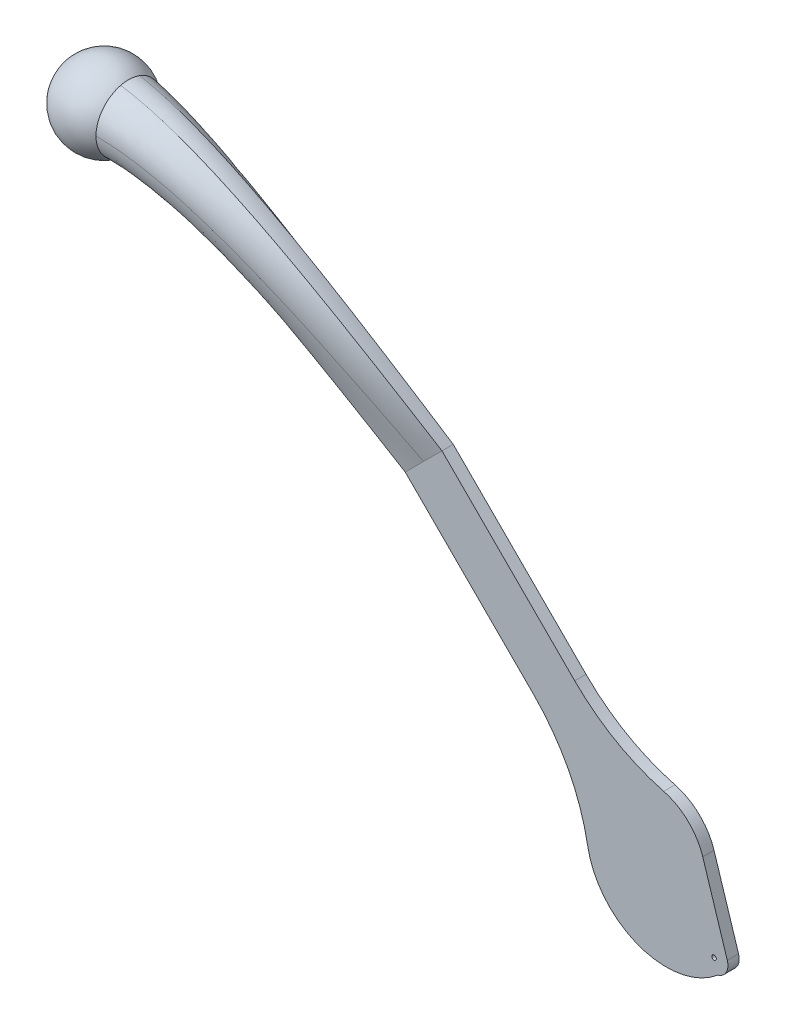
ISO-10303-21;
HEADER;
FILE_DESCRIPTION(('STEP AP214'),'2;1');
FILE_NAME('part.step','',(''),(''),'','','');
FILE_SCHEMA(('AUTOMOTIVE_DESIGN { 1 0 10303 214 1 1 1 1 }'));
ENDSEC;
DATA;
#1=APPLICATION_CONTEXT('core data for automotive mechanical design processes');
#2=APPLICATION_PROTOCOL_DEFINITION('international standard','automotive_design',2000,#1);
#3=PRODUCT_CONTEXT('',#1,'mechanical');
#4=PRODUCT('Part','Part','',(#3));
#5=PRODUCT_RELATED_PRODUCT_CATEGORY('part','',(#4));
#6=PRODUCT_DEFINITION_FORMATION('','',#4);
#7=PRODUCT_DEFINITION_CONTEXT('part definition',#1,'design');
#8=PRODUCT_DEFINITION('design','',#6,#7);
#9=PRODUCT_DEFINITION_SHAPE('','',#8);
#10=(LENGTH_UNIT() NAMED_UNIT(*) SI_UNIT(.MILLI.,.METRE.));
#11=(NAMED_UNIT(*) PLANE_ANGLE_UNIT() SI_UNIT($,.RADIAN.));
#12=(NAMED_UNIT(*) SI_UNIT($,.STERADIAN.) SOLID_ANGLE_UNIT());
#13=UNCERTAINTY_MEASURE_WITH_UNIT(LENGTH_MEASURE(1.E-05),#10,'distance_accuracy_value','');
#14=(GEOMETRIC_REPRESENTATION_CONTEXT(3) GLOBAL_UNCERTAINTY_ASSIGNED_CONTEXT((#13)) GLOBAL_UNIT_ASSIGNED_CONTEXT((#10,
#11,#12)) REPRESENTATION_CONTEXT('',''));
#15=CARTESIAN_POINT('',(0.,0.,0.));
#16=DIRECTION('',(0.,0.,1.));
#17=DIRECTION('',(1.,0.,0.));
#18=AXIS2_PLACEMENT_3D('',#15,#16,#17);
#19=CARTESIAN_POINT('',(-107.150199067263,-107.150199067263,186.923253530233));
#20=DIRECTION('',(-0.707106781186547,-0.707106781186548,0.));
#21=DIRECTION('',(0.707106781186548,-0.707106781186547,0.));
#22=AXIS2_PLACEMENT_3D('',#19,#20,#21);
#23=PLANE('',#22);
#24=DIRECTION('',(0.,0.,1.));
#25=VECTOR('',#24,1.);
#26=CARTESIAN_POINT('',(-67.8559594323085,-146.444438702217,186.923253530233));
#27=LINE('',#26,#25);
#28=CARTESIAN_POINT('',(-67.8559594323085,-146.444438702217,186.923253530233));
#29=VERTEX_POINT('',#28);
#30=CARTESIAN_POINT('',(-67.8559594323085,-146.444438702217,192.003253530233));
#31=VERTEX_POINT('',#30);
#32=EDGE_CURVE('E366',#29,#31,#27,.T.);
#33=ORIENTED_EDGE('',*,*,#32,.T.);
#34=DIRECTION('',(0.707106781186548,-0.707106781186547,0.));
#35=VECTOR('',#34,1.);
#36=CARTESIAN_POINT('',(-107.150199067263,-107.150199067263,192.003253530233));
#37=LINE('',#36,#35);
#38=CARTESIAN_POINT('',(-125.355351673041,-88.945046461485,192.003253530233));
#39=VERTEX_POINT('',#38);
#40=EDGE_CURVE('E319',#39,#31,#37,.T.);
#41=ORIENTED_EDGE('',*,*,#40,.F.);
#42=DIRECTION('',(0.,0.,1.));
#43=VECTOR('',#42,1.);
#44=CARTESIAN_POINT('',(-125.355351673041,-88.945046461485,186.923253530233));
#45=LINE('',#44,#43);
#46=CARTESIAN_POINT('',(-125.355351673041,-88.945046461485,186.923253530233));
#47=VERTEX_POINT('',#46);
#48=EDGE_CURVE('E49',#47,#39,#45,.T.);
#49=ORIENTED_EDGE('',*,*,#48,.F.);
#50=DIRECTION('',(0.707106781186548,-0.707106781186547,0.));
#51=VECTOR('',#50,1.);
#52=CARTESIAN_POINT('',(-107.150199067263,-107.150199067263,186.923253530233));
#53=LINE('',#52,#51);
#54=EDGE_CURVE('E339',#47,#29,#53,.T.);
#55=ORIENTED_EDGE('',*,*,#54,.T.);
#56=EDGE_LOOP('',(#33,#41,#49,#55));
#57=FACE_BOUND('',#56,.T.);
#58=ADVANCED_FACE('F45',(#57),#23,.T.);
#59=CARTESIAN_POINT('',(-90.6102871193429,-90.6102871193429,186.923253530233));
#60=DIRECTION('',(0.707106781186547,0.707106781186548,0.));
#61=DIRECTION('',(-0.707106781186548,0.707106781186547,0.));
#62=AXIS2_PLACEMENT_3D('',#59,#60,#61);
#63=PLANE('',#62);
#64=DIRECTION('',(0.,0.,1.));
#65=VECTOR('',#64,1.);
#66=CARTESIAN_POINT('',(-108.815439725121,-72.405134513565,186.923253530233));
#67=LINE('',#66,#65);
#68=CARTESIAN_POINT('',(-108.815439725121,-72.405134513565,186.923253530233));
#69=VERTEX_POINT('',#68);
#70=CARTESIAN_POINT('',(-108.815439725121,-72.405134513565,192.003253530233));
#71=VERTEX_POINT('',#70);
#72=EDGE_CURVE('E298',#69,#71,#67,.T.);
#73=ORIENTED_EDGE('',*,*,#72,.T.);
#74=DIRECTION('',(-0.707106781186548,0.707106781186547,0.));
#75=VECTOR('',#74,1.);
#76=CARTESIAN_POINT('',(-90.6102871193429,-90.6102871193429,192.003253530233));
#77=LINE('',#76,#75);
#78=CARTESIAN_POINT('',(-49.0428683704548,-132.177705868231,192.003253530233));
#79=VERTEX_POINT('',#78);
#80=EDGE_CURVE('E287',#79,#71,#77,.T.);
#81=ORIENTED_EDGE('',*,*,#80,.F.);
#82=DIRECTION('',(0.,0.,1.));
#83=VECTOR('',#82,1.);
#84=CARTESIAN_POINT('',(-49.0428683704548,-132.177705868231,186.923253530233));
#85=LINE('',#84,#83);
#86=CARTESIAN_POINT('',(-49.0428683704548,-132.177705868231,186.923253530233));
#87=VERTEX_POINT('',#86);
#88=EDGE_CURVE('E11',#87,#79,#85,.T.);
#89=ORIENTED_EDGE('',*,*,#88,.F.);
#90=DIRECTION('',(-0.707106781186548,0.707106781186547,0.));
#91=VECTOR('',#90,1.);
#92=CARTESIAN_POINT('',(-90.6102871193429,-90.6102871193429,186.923253530233));
#93=LINE('',#92,#91);
#94=EDGE_CURVE('E72',#87,#69,#93,.T.);
#95=ORIENTED_EDGE('',*,*,#94,.T.);
#96=EDGE_LOOP('',(#73,#81,#89,#95));
#97=FACE_BOUND('',#96,.T.);
#98=ADVANCED_FACE('F250',(#97),#63,.T.);
#99=CARTESIAN_POINT('',(13.8189244770289,-69.3159130207465,186.923253530233));
#100=DIRECTION('',(0.,0.,1.));
#101=DIRECTION('',(1.,0.,0.));
#102=AXIS2_PLACEMENT_3D('',#99,#100,#101);
#103=CYLINDRICAL_SURFACE('',#102,88.9);
#104=ORIENTED_EDGE('',*,*,#88,.T.);
#105=CARTESIAN_POINT('',(13.8189244770289,-69.3159130207465,192.003253530233));
#106=DIRECTION('',(0.,0.,1.));
#107=DIRECTION('',(1.,0.,0.));
#108=AXIS2_PLACEMENT_3D('',#105,#106,#107);
#109=CIRCLE('',#108,88.9);
#110=CARTESIAN_POINT('',(-8.96826600026344,-155.245849306954,192.003253530233));
#111=VERTEX_POINT('',#110);
#112=EDGE_CURVE('E295',#79,#111,#109,.T.);
#113=ORIENTED_EDGE('',*,*,#112,.T.);
#114=DIRECTION('',(0.,0.,1.));
#115=VECTOR('',#114,1.);
#116=CARTESIAN_POINT('',(-8.96826600026344,-155.245849306954,186.923253530233));
#117=LINE('',#116,#115);
#118=CARTESIAN_POINT('',(-8.96826600026344,-155.245849306954,186.923253530233));
#119=VERTEX_POINT('',#118);
#120=EDGE_CURVE('E55',#119,#111,#117,.T.);
#121=ORIENTED_EDGE('',*,*,#120,.F.);
#122=CARTESIAN_POINT('',(13.8189244770289,-69.3159130207465,186.923253530233));
#123=DIRECTION('',(0.,0.,1.));
#124=DIRECTION('',(1.,0.,0.));
#125=AXIS2_PLACEMENT_3D('',#122,#123,#124);
#126=CIRCLE('',#125,88.9);
#127=EDGE_CURVE('E355',#87,#119,#126,.T.);
#128=ORIENTED_EDGE('',*,*,#127,.F.);
#129=EDGE_LOOP('',(#104,#113,#121,#128));
#130=FACE_BOUND('',#129,.T.);
#131=ADVANCED_FACE('F271',(#130),#103,.F.);
#132=CARTESIAN_POINT('',(-15.42794024578,-179.605122421383,186.923253530233));
#133=DIRECTION('',(0.,0.,1.));
#134=DIRECTION('',(1.,0.,0.));
#135=AXIS2_PLACEMENT_3D('',#132,#133,#134);
#136=CYLINDRICAL_SURFACE('',#135,25.2012217565252);
#137=ORIENTED_EDGE('',*,*,#120,.T.);
#138=CARTESIAN_POINT('',(-15.42794024578,-179.605122421383,192.003253530233));
#139=DIRECTION('',(0.,0.,1.));
#140=DIRECTION('',(1.,0.,0.));
#141=AXIS2_PLACEMENT_3D('',#138,#139,#140);
#142=CIRCLE('',#141,25.2012217565252);
#143=CARTESIAN_POINT('',(8.59356538739768,-171.984830751324,192.003253530233));
#144=VERTEX_POINT('',#143);
#145=EDGE_CURVE('E332',#144,#111,#142,.T.);
#146=ORIENTED_EDGE('',*,*,#145,.F.);
#147=DIRECTION('',(0.,0.,1.));
#148=VECTOR('',#147,1.);
#149=CARTESIAN_POINT('',(8.59356538739768,-171.984830751324,186.923253530233));
#150=LINE('',#149,#148);
#151=CARTESIAN_POINT('',(8.59356538739768,-171.984830751324,186.923253530233));
#152=VERTEX_POINT('',#151);
#153=EDGE_CURVE('E358',#152,#144,#150,.T.);
#154=ORIENTED_EDGE('',*,*,#153,.F.);
#155=CARTESIAN_POINT('',(-15.42794024578,-179.605122421383,186.923253530233));
#156=DIRECTION('',(0.,0.,1.));
#157=DIRECTION('',(1.,0.,0.));
#158=AXIS2_PLACEMENT_3D('',#155,#156,#157);
#159=CIRCLE('',#158,25.2012217565252);
#160=EDGE_CURVE('E352',#152,#119,#159,.T.);
#161=ORIENTED_EDGE('',*,*,#160,.T.);
#162=EDGE_LOOP('',(#137,#146,#154,#161));
#163=FACE_BOUND('',#162,.T.);
#164=ADVANCED_FACE('F267',(#163),#136,.T.);
#165=CARTESIAN_POINT('',(-41.7621478024849,-13.2481182438251,186.923253530233));
#166=DIRECTION('',(0.953188137672649,0.302377866584422,0.));
#167=DIRECTION('',(-0.302377866584422,0.95318813767265,0.));
#168=AXIS2_PLACEMENT_3D('',#165,#166,#167);
#169=PLANE('',#168);
#170=ORIENTED_EDGE('',*,*,#153,.T.);
#171=DIRECTION('',(-0.302377866584422,0.953188137672649,0.));
#172=VECTOR('',#171,1.);
#173=CARTESIAN_POINT('',(-41.7621478024849,-13.2481182438251,192.003253530233));
#174=LINE('',#173,#172);
#175=CARTESIAN_POINT('',(19.6489298910755,-206.834743615601,192.003253530233));
#176=VERTEX_POINT('',#175);
#177=EDGE_CURVE('E329',#176,#144,#174,.T.);
#178=ORIENTED_EDGE('',*,*,#177,.F.);
#179=DIRECTION('',(0.,0.,1.));
#180=VECTOR('',#179,1.);
#181=CARTESIAN_POINT('',(19.6489298910755,-206.834743615601,186.923253530233));
#182=LINE('',#181,#180);
#183=CARTESIAN_POINT('',(19.6489298910755,-206.834743615601,186.923253530233));
#184=VERTEX_POINT('',#183);
#185=EDGE_CURVE('E360',#184,#176,#182,.T.);
#186=ORIENTED_EDGE('',*,*,#185,.F.);
#187=DIRECTION('',(-0.302377866584422,0.953188137672649,0.));
#188=VECTOR('',#187,1.);
#189=CARTESIAN_POINT('',(-41.7621478024849,-13.2481182438251,186.923253530233));
#190=LINE('',#189,#188);
#191=EDGE_CURVE('E349',#184,#152,#190,.T.);
#192=ORIENTED_EDGE('',*,*,#191,.T.);
#193=EDGE_LOOP('',(#170,#178,#186,#192));
#194=FACE_BOUND('',#193,.T.);
#195=ADVANCED_FACE('F263',(#194),#169,.T.);
#196=CARTESIAN_POINT('',(13.6915333224159,-208.724595989579,186.923253530233));
#197=DIRECTION('',(0.,0.,1.));
#198=DIRECTION('',(1.,0.,0.));
#199=AXIS2_PLACEMENT_3D('',#196,#197,#198);
#200=CYLINDRICAL_SURFACE('',#199,6.24996926966111);
#201=ORIENTED_EDGE('',*,*,#185,.T.);
#202=CARTESIAN_POINT('',(13.6915333224159,-208.724595989579,192.003253530233));
#203=DIRECTION('',(0.,0.,1.));
#204=DIRECTION('',(1.,0.,0.));
#205=AXIS2_PLACEMENT_3D('',#202,#203,#204);
#206=CIRCLE('',#205,6.24996926966111);
#207=CARTESIAN_POINT('',(15.364323678405,-214.746546528783,192.003253530233));
#208=VERTEX_POINT('',#207);
#209=EDGE_CURVE('E326',#208,#176,#206,.T.);
#210=ORIENTED_EDGE('',*,*,#209,.F.);
#211=DIRECTION('',(0.,0.,1.));
#212=VECTOR('',#211,1.);
#213=CARTESIAN_POINT('',(15.364323678405,-214.746546528783,186.923253530233));
#214=LINE('',#213,#212);
#215=CARTESIAN_POINT('',(15.364323678405,-214.746546528783,186.923253530233));
#216=VERTEX_POINT('',#215);
#217=EDGE_CURVE('E362',#216,#208,#214,.T.);
#218=ORIENTED_EDGE('',*,*,#217,.F.);
#219=CARTESIAN_POINT('',(13.6915333224159,-208.724595989579,186.923253530233));
#220=DIRECTION('',(0.,0.,1.));
#221=DIRECTION('',(1.,0.,0.));
#222=AXIS2_PLACEMENT_3D('',#219,#220,#221);
#223=CIRCLE('',#222,6.24996926966111);
#224=EDGE_CURVE('E346',#216,#184,#223,.T.);
#225=ORIENTED_EDGE('',*,*,#224,.T.);
#226=EDGE_LOOP('',(#201,#210,#218,#225));
#227=FACE_BOUND('',#226,.T.);
#228=ADVANCED_FACE('F259',(#227),#200,.T.);
#229=CARTESIAN_POINT('',(-7.80794024578001,-187.225122421383,186.923253530233));
#230=DIRECTION('',(0.,0.,1.));
#231=DIRECTION('',(1.,0.,0.));
#232=AXIS2_PLACEMENT_3D('',#229,#230,#231);
#233=CYLINDRICAL_SURFACE('',#232,35.9775291018081);
#234=ORIENTED_EDGE('',*,*,#217,.T.);
#235=CARTESIAN_POINT('',(-7.80794024578001,-187.225122421383,192.003253530233));
#236=DIRECTION('',(0.,0.,1.));
#237=DIRECTION('',(1.,0.,0.));
#238=AXIS2_PLACEMENT_3D('',#235,#236,#237);
#239=CIRCLE('',#238,35.9775291018081);
#240=CARTESIAN_POINT('',(-43.2185651288713,-193.586745300841,192.003253530233));
#241=VERTEX_POINT('',#240);
#242=EDGE_CURVE('E323',#241,#208,#239,.T.);
#243=ORIENTED_EDGE('',*,*,#242,.F.);
#244=DIRECTION('',(0.,0.,1.));
#245=VECTOR('',#244,1.);
#246=CARTESIAN_POINT('',(-43.2185651288713,-193.586745300841,186.923253530233));
#247=LINE('',#246,#245);
#248=CARTESIAN_POINT('',(-43.2185651288713,-193.586745300841,186.923253530233));
#249=VERTEX_POINT('',#248);
#250=EDGE_CURVE('E364',#249,#241,#247,.T.);
#251=ORIENTED_EDGE('',*,*,#250,.F.);
#252=CARTESIAN_POINT('',(-7.80794024578001,-187.225122421383,186.923253530233));
#253=DIRECTION('',(0.,0.,1.));
#254=DIRECTION('',(1.,0.,0.));
#255=AXIS2_PLACEMENT_3D('',#252,#253,#254);
#256=CIRCLE('',#255,35.9775291018081);
#257=EDGE_CURVE('E343',#249,#216,#256,.T.);
#258=ORIENTED_EDGE('',*,*,#257,.T.);
#259=EDGE_LOOP('',(#234,#243,#251,#258));
#260=FACE_BOUND('',#259,.T.);
#261=ADVANCED_FACE('F256',(#260),#233,.T.);
#262=CARTESIAN_POINT('',(13.6915333224159,-208.724595989579,186.923253530233));
#263=DIRECTION('',(0.,0.,1.));
#264=DIRECTION('',(1.,0.,0.));
#265=AXIS2_PLACEMENT_3D('',#262,#263,#264);
#266=CYLINDRICAL_SURFACE('',#265,1.01600000000001);
#267=CARTESIAN_POINT('',(13.6915333224159,-208.724595989579,186.923253530233));
#268=DIRECTION('',(0.,0.,1.));
#269=DIRECTION('',(1.,0.,0.));
#270=AXIS2_PLACEMENT_3D('',#267,#268,#269);
#271=CIRCLE('',#270,1.01600000000001);
#272=CARTESIAN_POINT('',(14.7075333224159,-208.724595989579,186.923253530233));
#273=VERTEX_POINT('',#272);
#274=EDGE_CURVE('E294',#273,#273,#271,.T.);
#275=ORIENTED_EDGE('',*,*,#274,.F.);
#276=EDGE_LOOP('',(#275));
#277=FACE_BOUND('',#276,.T.);
#278=CARTESIAN_POINT('',(13.6915333224159,-208.724595989579,192.003253530233));
#279=DIRECTION('',(0.,0.,1.));
#280=DIRECTION('',(1.,0.,0.));
#281=AXIS2_PLACEMENT_3D('',#278,#279,#280);
#282=CIRCLE('',#281,1.01600000000001);
#283=CARTESIAN_POINT('',(14.7075333224159,-208.724595989579,192.003253530233));
#284=VERTEX_POINT('',#283);
#285=EDGE_CURVE('E316',#284,#284,#282,.T.);
#286=ORIENTED_EDGE('',*,*,#285,.T.);
#287=EDGE_LOOP('',(#286));
#288=FACE_BOUND('',#287,.T.);
#289=ADVANCED_FACE('F47',(#277,#288),#266,.F.);
#290=CARTESIAN_POINT('',(-130.717752279792,-209.306231549702,186.923253530233));
#291=DIRECTION('',(0.,0.,1.));
#292=DIRECTION('',(1.,0.,0.));
#293=AXIS2_PLACEMENT_3D('',#290,#291,#292);
#294=CYLINDRICAL_SURFACE('',#293,88.9);
#295=ORIENTED_EDGE('',*,*,#250,.T.);
#296=CARTESIAN_POINT('',(-130.717752279792,-209.306231549702,192.003253530233));
#297=DIRECTION('',(0.,0.,1.));
#298=DIRECTION('',(1.,0.,0.));
#299=AXIS2_PLACEMENT_3D('',#296,#297,#298);
#300=CIRCLE('',#299,88.9);
#301=EDGE_CURVE('E320',#31,#241,#300,.F.);
#302=ORIENTED_EDGE('',*,*,#301,.F.);
#303=ORIENTED_EDGE('',*,*,#32,.F.);
#304=CARTESIAN_POINT('',(-130.717752279792,-209.306231549702,186.923253530233));
#305=DIRECTION('',(0.,0.,1.));
#306=DIRECTION('',(1.,0.,0.));
#307=AXIS2_PLACEMENT_3D('',#304,#305,#306);
#308=CIRCLE('',#307,88.9);
#309=EDGE_CURVE('E340',#29,#249,#308,.F.);
#310=ORIENTED_EDGE('',*,*,#309,.T.);
#311=EDGE_LOOP('',(#295,#302,#303,#310));
#312=FACE_BOUND('',#311,.T.);
#313=ADVANCED_FACE('F251',(#312),#294,.F.);
#314=CARTESIAN_POINT('',(0.,0.,186.923253530233));
#315=DIRECTION('',(0.,0.,1.));
#316=DIRECTION('',(1.,0.,0.));
#317=AXIS2_PLACEMENT_3D('',#314,#315,#316);
#318=PLANE('',#317);
#319=ORIENTED_EDGE('',*,*,#274,.T.);
#320=EDGE_LOOP('',(#319));
#321=FACE_BOUND('',#320,.T.);
#322=ORIENTED_EDGE('',*,*,#54,.F.);
#323=DIRECTION('',(-0.707106781186548,-0.707106781186547,0.));
#324=VECTOR('',#323,1.);
#325=CARTESIAN_POINT('',(-18.2051526057778,18.2051526057778,186.923253530233));
#326=LINE('',#325,#324);
#327=EDGE_CURVE('E300',#69,#47,#326,.T.);
#328=ORIENTED_EDGE('',*,*,#327,.F.);
#329=ORIENTED_EDGE('',*,*,#94,.F.);
#330=ORIENTED_EDGE('',*,*,#127,.T.);
#331=ORIENTED_EDGE('',*,*,#160,.F.);
#332=ORIENTED_EDGE('',*,*,#191,.F.);
#333=ORIENTED_EDGE('',*,*,#224,.F.);
#334=ORIENTED_EDGE('',*,*,#257,.F.);
#335=ORIENTED_EDGE('',*,*,#309,.F.);
#336=EDGE_LOOP('',(#322,#328,#329,#330,#331,#332,#333,#334,#335));
#337=FACE_BOUND('',#336,.T.);
#338=ADVANCED_FACE('F254',(#321,#337),#318,.F.);
#339=CARTESIAN_POINT('',(0.,0.,192.003253530233));
#340=DIRECTION('',(0.,0.,1.));
#341=DIRECTION('',(1.,0.,0.));
#342=AXIS2_PLACEMENT_3D('',#339,#340,#341);
#343=PLANE('',#342);
#344=ORIENTED_EDGE('',*,*,#285,.F.);
#345=EDGE_LOOP('',(#344));
#346=FACE_BOUND('',#345,.T.);
#347=ORIENTED_EDGE('',*,*,#40,.T.);
#348=ORIENTED_EDGE('',*,*,#301,.T.);
#349=ORIENTED_EDGE('',*,*,#242,.T.);
#350=ORIENTED_EDGE('',*,*,#209,.T.);
#351=ORIENTED_EDGE('',*,*,#177,.T.);
#352=ORIENTED_EDGE('',*,*,#145,.T.);
#353=ORIENTED_EDGE('',*,*,#112,.F.);
#354=ORIENTED_EDGE('',*,*,#80,.T.);
#355=DIRECTION('',(-0.707106781186548,-0.707106781186547,0.));
#356=VECTOR('',#355,1.);
#357=CARTESIAN_POINT('',(-18.2051526057778,18.2051526057778,192.003253530233));
#358=LINE('',#357,#356);
#359=CARTESIAN_POINT('',(-117.085395699081,-80.6750904875248,192.003253530233));
#360=VERTEX_POINT('',#359);
#361=EDGE_CURVE('E63',#71,#360,#358,.T.);
#362=ORIENTED_EDGE('',*,*,#361,.T.);
#363=EDGE_CURVE('E229',#360,#39,#358,.T.);
#364=ORIENTED_EDGE('',*,*,#363,.T.);
#365=EDGE_LOOP('',(#347,#348,#349,#350,#351,#352,#353,#354,#362,#364));
#366=FACE_BOUND('',#365,.T.);
#367=ADVANCED_FACE('F486',(#346,#366),#343,.T.);
#368=CARTESIAN_POINT('',(-238.930478107692,12.3145718682729,206.522208416313));
#369=CARTESIAN_POINT('',(-197.83373148076,10.3332249333333,210.236967020579));
#370=CARTESIAN_POINT('',(-155.533049901972,-26.4628293930945,202.609925324495));
#371=CARTESIAN_POINT('',(-108.815439725121,-72.405134513565,192.003253530233));
#372=CARTESIAN_POINT('',(-238.930478107692,11.9258931658617,208.104076406941));
#373=CARTESIAN_POINT('',(-198.062453351147,9.84538392800528,211.291545680997));
#374=CARTESIAN_POINT('',(-155.990493642747,-27.0498327013393,203.137214654704));
#375=CARTESIAN_POINT('',(-109.501605336283,-73.0913001247268,192.003253530233));
#376=CARTESIAN_POINT('',(-238.930478107691,10.6179720983845,211.12977278465));
#377=CARTESIAN_POINT('',(-198.520888673991,8.51500122684253,213.30867659947));
#378=CARTESIAN_POINT('',(-156.907364288436,-28.4026770361877,204.14578011394));
#379=CARTESIAN_POINT('',(-110.876911304816,-74.4666060932606,192.003253530232));
#380=CARTESIAN_POINT('',(-238.930478107693,7.29017681998598,214.768926996949));
#381=CARTESIAN_POINT('',(-199.210424152953,5.60693556228281,215.734779407669));
#382=CARTESIAN_POINT('',(-158.286435246358,-30.8910130869085,205.35883151804));
#383=CARTESIAN_POINT('',(-112.945517741699,-76.5352125301427,192.003253530233));
#384=CARTESIAN_POINT('',(-238.930478107691,2.96301759690974,217.12291546782));
#385=CARTESIAN_POINT('',(-199.900718181108,2.03186871874234,217.304105054916));
#386=CARTESIAN_POINT('',(-159.66702330267,-33.7139875509132,206.143494341664));
#387=CARTESIAN_POINT('',(-115.016399826167,-78.6060946146116,192.003253530233));
#388=CARTESIAN_POINT('',(-238.930478107692,-0.27735201929284,217.66648422911));
#389=CARTESIAN_POINT('',(-200.360662472803,-0.588321983753776,217.66648422911));
#390=CARTESIAN_POINT('',(-160.586911886059,-35.7139993397029,206.32468392876));
#391=CARTESIAN_POINT('',(-116.396232701251,-79.9859274896948,192.003253530233));
#392=CARTESIAN_POINT('',(-238.930478107692,-1.89942491050567,217.66648422911));
#393=CARTESIAN_POINT('',(-200.59038347208,-1.89942491050565,217.66648422911));
#394=CARTESIAN_POINT('',(-161.046353884612,-36.7141323019938,206.32468392876));
#395=CARTESIAN_POINT('',(-117.085395699081,-80.6750904875248,192.003253530233));
#396=B_SPLINE_SURFACE_WITH_KNOTS('',3,3,((#368,#369,#370,#371),(#372,#373,#374,#375),(#376,#377,
#378,#379),(#380,#381,#382,#383),(#384,#385,#386,#387),(#388,#389,#390,#391),(#392,#393,#394,
#395)),.UNSPECIFIED.,.F.,.F.,.F.,(4,1,1,1,4),(4,4),(0.791476476856258,0.843607357642194,
0.895738238428129,0.947869119214064,1.),(0.,1.),.UNSPECIFIED.);
#397=CARTESIAN_POINT('',(-238.930478107692,-1.89942491050567,203.029705971872));
#398=DIRECTION('',(-1.,0.,0.));
#399=DIRECTION('',(0.,0.,1.));
#400=AXIS2_PLACEMENT_3D('',#397,#398,#399);
#401=CIRCLE('',#400,14.636778257238);
#402=CARTESIAN_POINT('',(-238.930478107692,-1.89942491050567,217.66648422911));
#403=VERTEX_POINT('',#402);
#404=CARTESIAN_POINT('',(-238.930478107692,12.3157650052163,206.522503750547));
#405=VERTEX_POINT('',#404);
#406=EDGE_CURVE('E159',#403,#405,#401,.T.);
#407=CARTESIAN_POINT('',(-238.930478107692,-1.89942491050567,217.66648422911));
#408=CARTESIAN_POINT('',(-200.59038347208,-1.89942491050565,217.66648422911));
#409=CARTESIAN_POINT('',(-161.046353884612,-36.7141323019938,206.32468392876));
#410=CARTESIAN_POINT('',(-117.085395699081,-80.6750904875248,192.003253530233));
#411=B_SPLINE_CURVE_WITH_KNOTS('',3,(#407,#408,#409,#410),.UNSPECIFIED.,.F.,.F.,(4,4),(0.,1.),.UNSPECIFIED.);
#412=EDGE_CURVE('E163',#403,#360,#411,.T.);
#413=CARTESIAN_POINT('',(-238.930478107692,12.3145718682729,206.522208416313));
#414=CARTESIAN_POINT('',(-197.83373148076,10.3332249333333,210.236967020579));
#415=CARTESIAN_POINT('',(-155.533049901972,-26.4628293930945,202.609925324495));
#416=CARTESIAN_POINT('',(-108.815439725121,-72.405134513565,192.003253530233));
#417=B_SPLINE_CURVE_WITH_KNOTS('',3,(#413,#414,#415,#416),.UNSPECIFIED.,.F.,.F.,(4,4),(0.,1.),.UNSPECIFIED.);
#418=EDGE_CURVE('E144',#405,#71,#417,.T.);
#419=ORIENTED_EDGE('',*,*,#406,.F.);
#420=ORIENTED_EDGE('',*,*,#412,.T.);
#421=ORIENTED_EDGE('',*,*,#361,.F.);
#422=ORIENTED_EDGE('',*,*,#418,.F.);
#423=EDGE_LOOP('',(#419,#420,#421,#422));
#424=FACE_BOUND('',#423,.T.);
#425=ADVANCED_FACE('F157',(#424),#396,.T.);
#426=CARTESIAN_POINT('',(-238.930478107692,11.8342626096277,197.96797653907));
#427=CARTESIAN_POINT('',(-197.83373148076,10.0130187609032,202.84081243575));
#428=CARTESIAN_POINT('',(-155.533049901972,-26.6229324793095,196.37184803208));
#429=CARTESIAN_POINT('',(-108.815439725121,-72.405134513565,186.923253530233));
#430=CARTESIAN_POINT('',(-238.930478107692,12.0848397711968,198.647852554246));
#431=CARTESIAN_POINT('',(-197.83373148076,10.1800702019492,203.435174223645));
#432=CARTESIAN_POINT('',(-155.533049901972,-26.5394067587865,196.880695592695));
#433=CARTESIAN_POINT('',(-108.815439725121,-72.405134513565,187.346586863566));
#434=CARTESIAN_POINT('',(-238.930478107692,12.4848547452463,200.044875819601));
#435=CARTESIAN_POINT('',(-197.83373148076,10.4467468513156,204.648745289437));
#436=CARTESIAN_POINT('',(-155.533049901972,-26.4060684341033,197.910814458924));
#437=CARTESIAN_POINT('',(-108.815439725121,-72.405134513565,188.193253530232));
#438=CARTESIAN_POINT('',(-238.930478107692,12.7681570849508,202.206139866177));
#439=CARTESIAN_POINT('',(-197.83373148076,10.6356150777853,206.512921320488));
#440=CARTESIAN_POINT('',(-155.533049901972,-26.3116343208685,199.47790247445));
#441=CARTESIAN_POINT('',(-108.815439725121,-72.4051345135651,189.463253530233));
#442=CARTESIAN_POINT('',(-238.930478107692,12.7285771538363,204.385533342296));
#443=CARTESIAN_POINT('',(-197.83373148076,10.6092284570422,208.389183637901));
#444=CARTESIAN_POINT('',(-155.533049901972,-26.3248276312399,201.051033633155));
#445=CARTESIAN_POINT('',(-108.815439725121,-72.4051345135649,190.733253530232));
#446=CARTESIAN_POINT('',(-238.930478107692,12.4874656115911,205.818555047507));
#447=CARTESIAN_POINT('',(-197.83373148076,10.4484874288788,209.626753663596));
#448=CARTESIAN_POINT('',(-155.533049901972,-26.4051981453217,202.093151979337));
#449=CARTESIAN_POINT('',(-108.815439725121,-72.405134513565,191.579920196899));
#450=CARTESIAN_POINT('',(-238.930478107692,12.3145718682729,206.522208416313));
#451=CARTESIAN_POINT('',(-197.83373148076,10.3332249333333,210.236967020579));
#452=CARTESIAN_POINT('',(-155.533049901972,-26.4628293930945,202.609925324495));
#453=CARTESIAN_POINT('',(-108.815439725121,-72.405134513565,192.003253530233));
#454=B_SPLINE_SURFACE_WITH_KNOTS('',3,3,((#426,#427,#428,#429),(#430,#431,#432,#433),(#434,#435,
#436,#437),(#438,#439,#440,#441),(#442,#443,#444,#445),(#446,#447,#448,#449),(#450,#451,#452,
#453)),.UNSPECIFIED.,.F.,.F.,.F.,(4,1,1,1,4),(4,4),(0.699596548591104,0.722566530657392,
0.745536512723681,0.76850649478997,0.791476476856258),(0.,1.),.UNSPECIFIED.);
#455=CARTESIAN_POINT('',(-238.930478107692,11.8344396906459,197.967910822549));
#456=VERTEX_POINT('',#455);
#457=EDGE_CURVE('E139',#405,#456,#401,.T.);
#458=CARTESIAN_POINT('',(-238.930478107692,11.8342626096277,197.96797653907));
#459=CARTESIAN_POINT('',(-197.83373148076,10.0130187609032,202.84081243575));
#460=CARTESIAN_POINT('',(-155.533049901972,-26.6229324793095,196.37184803208));
#461=CARTESIAN_POINT('',(-108.815439725121,-72.405134513565,186.923253530233));
#462=B_SPLINE_CURVE_WITH_KNOTS('',3,(#458,#459,#460,#461),.UNSPECIFIED.,.F.,.F.,(4,4),(0.,1.),.UNSPECIFIED.);
#463=EDGE_CURVE('E146',#456,#69,#462,.T.);
#464=ORIENTED_EDGE('',*,*,#457,.F.);
#465=ORIENTED_EDGE('',*,*,#418,.T.);
#466=ORIENTED_EDGE('',*,*,#72,.F.);
#467=ORIENTED_EDGE('',*,*,#463,.F.);
#468=EDGE_LOOP('',(#464,#465,#466,#467));
#469=FACE_BOUND('',#468,.T.);
#470=ADVANCED_FACE('F142',(#469),#454,.T.);
#471=CARTESIAN_POINT('',(-238.930478107692,-15.633112430639,197.96797653907));
#472=CARTESIAN_POINT('',(-203.3470354634,-13.8118685819146,202.84081243575));
#473=CARTESIAN_POINT('',(-166.559657867252,-46.8053321246784,196.371848032081));
#474=CARTESIAN_POINT('',(-125.355351673041,-88.945046461485,186.923253530233));
#475=CARTESIAN_POINT('',(-238.930478107692,-15.1194814820847,196.574372427716));
#476=CARTESIAN_POINT('',(-203.117314464123,-13.2397269502684,201.911743028181));
#477=CARTESIAN_POINT('',(-166.100215868699,-46.1746798099403,195.907313328296));
#478=CARTESIAN_POINT('',(-124.666188675211,-88.255883463655,186.923253530233));
#479=CARTESIAN_POINT('',(-238.930478107692,-13.6650492125604,193.944841222212));
#480=CARTESIAN_POINT('',(-202.657872465569,-11.8106634386989,200.158722224511));
#481=CARTESIAN_POINT('',(-165.181331871592,-44.7709850563256,195.030802926461));
#482=CARTESIAN_POINT('',(-123.287862679551,-86.877557467995,186.923253530233));
#483=CARTESIAN_POINT('',(-238.930478107693,-10.4007653621165,190.835887788082));
#484=CARTESIAN_POINT('',(-201.96870946774,-8.9453112072396,198.086086601758));
#485=CARTESIAN_POINT('',(-163.803005875932,-42.3045644438509,193.994485115084));
#486=CARTESIAN_POINT('',(-121.220373686061,-84.8100684745049,186.923253530233));
#487=CARTESIAN_POINT('',(-238.930478107692,-6.35499384775136,188.84840630308));
#488=CARTESIAN_POINT('',(-201.279546469909,-5.55896719983287,196.76109894509));
#489=CARTESIAN_POINT('',(-162.424679880272,-39.5776479434026,193.33199128675));
#490=CARTESIAN_POINT('',(-119.152884692571,-82.742579481015,186.923253530233));
#491=CARTESIAN_POINT('',(-238.930478107692,-1.8994249105057,188.164917576732));
#492=CARTESIAN_POINT('',(-200.59038347208,-1.89942491050578,196.305439794191));
#493=CARTESIAN_POINT('',(-161.046353884612,-36.714132301994,193.104161711301));
#494=CARTESIAN_POINT('',(-117.085395699081,-80.6750904875251,186.923253530233));
#495=CARTESIAN_POINT('',(-238.930478107692,2.55614402673993,188.84840630308));
#496=CARTESIAN_POINT('',(-199.901220474249,1.76011737882133,196.76109894509));
#497=CARTESIAN_POINT('',(-159.668027888952,-33.8506166605854,193.33199128675));
#498=CARTESIAN_POINT('',(-115.017906705591,-78.607601494035,186.923253530233));
#499=CARTESIAN_POINT('',(-238.930478107693,6.60191554110512,190.835887788082));
#500=CARTESIAN_POINT('',(-199.21205747642,5.14646138622815,198.086086601758));
#501=CARTESIAN_POINT('',(-158.289701893292,-31.123700160137,193.994485115084));
#502=CARTESIAN_POINT('',(-112.950417712101,-76.540112500545,186.923253530233));
#503=CARTESIAN_POINT('',(-238.930478107692,9.86619939154909,193.944841222212));
#504=CARTESIAN_POINT('',(-198.522894478589,8.01181361768745,200.158722224511));
#505=CARTESIAN_POINT('',(-156.911375897632,-28.6572795476624,195.030802926461));
#506=CARTESIAN_POINT('',(-110.882928718611,-74.472623507055,186.923253530233));
#507=CARTESIAN_POINT('',(-238.930478107692,11.3206316610733,196.574372427716));
#508=CARTESIAN_POINT('',(-198.063452480036,9.44087712925693,201.911743028181));
#509=CARTESIAN_POINT('',(-155.992491900525,-27.2535847940476,195.907313328296));
#510=CARTESIAN_POINT('',(-109.504602722951,-73.094297511395,186.923253530233));
#511=CARTESIAN_POINT('',(-238.930478107692,11.8342626096277,197.96797653907));
#512=CARTESIAN_POINT('',(-197.83373148076,10.0130187609032,202.84081243575));
#513=CARTESIAN_POINT('',(-155.533049901972,-26.6229324793095,196.37184803208));
#514=CARTESIAN_POINT('',(-108.815439725121,-72.405134513565,186.923253530233));
#515=B_SPLINE_SURFACE_WITH_KNOTS('',3,3,((#471,#472,#473,#474),(#475,#476,#477,#478),(#479,#480,
#481,#482),(#483,#484,#485,#486),(#487,#488,#489,#490),(#491,#492,#493,#494),(#495,#496,#497,
#498),(#499,#500,#501,#502),(#503,#504,#505,#506),(#507,#508,#509,#510),(#511,#512,#513,#514)),
.UNSPECIFIED.,.F.,.F.,.F.,(4,1,1,1,1,1,1,1,4),(4,4),(0.300403451408902,0.350302588556677,
0.400201725704453,0.450100862852228,0.500000000000003,0.549899137147778,0.599798274295553,
0.649697411443328,0.699596548591104),(0.,1.),.UNSPECIFIED.);
#516=CARTESIAN_POINT('',(-238.930478107692,-15.6332692563157,197.967918356782));
#517=VERTEX_POINT('',#516);
#518=EDGE_CURVE('E152',#456,#517,#401,.T.);
#519=CARTESIAN_POINT('',(-238.930478107692,-15.633112430639,197.96797653907));
#520=CARTESIAN_POINT('',(-203.3470354634,-13.8118685819146,202.84081243575));
#521=CARTESIAN_POINT('',(-166.559657867252,-46.8053321246784,196.371848032081));
#522=CARTESIAN_POINT('',(-125.355351673041,-88.945046461485,186.923253530233));
#523=B_SPLINE_CURVE_WITH_KNOTS('',3,(#519,#520,#521,#522),.UNSPECIFIED.,.F.,.F.,(4,4),(0.,1.),.UNSPECIFIED.);
#524=EDGE_CURVE('E388',#517,#47,#523,.T.);
#525=ORIENTED_EDGE('',*,*,#518,.F.);
#526=ORIENTED_EDGE('',*,*,#463,.T.);
#527=ORIENTED_EDGE('',*,*,#327,.T.);
#528=ORIENTED_EDGE('',*,*,#524,.F.);
#529=EDGE_LOOP('',(#525,#526,#527,#528));
#530=FACE_BOUND('',#529,.T.);
#531=ADVANCED_FACE('F387',(#530),#515,.T.);
#532=CARTESIAN_POINT('',(-238.930478107692,-16.1134216892842,206.522208416313));
#533=CARTESIAN_POINT('',(-203.3470354634,-14.1320747543448,210.236967020579));
#534=CARTESIAN_POINT('',(-166.559657867252,-46.9654352108935,202.609925324495));
#535=CARTESIAN_POINT('',(-125.355351673041,-88.945046461485,192.003253530233));
#536=CARTESIAN_POINT('',(-238.930478107692,-16.2863154326025,205.818555047507));
#537=CARTESIAN_POINT('',(-203.3470354634,-14.2473372498903,209.626753663596));
#538=CARTESIAN_POINT('',(-166.559657867252,-47.0230664586662,202.093151979337));
#539=CARTESIAN_POINT('',(-125.355351673041,-88.945046461485,191.579920196899));
#540=CARTESIAN_POINT('',(-238.930478107692,-16.5274269748476,204.385533342297));
#541=CARTESIAN_POINT('',(-203.3470354634,-14.4080782780537,208.389183637901));
#542=CARTESIAN_POINT('',(-166.559657867252,-47.1034369727479,201.051033633156));
#543=CARTESIAN_POINT('',(-125.355351673041,-88.9450464614849,190.733253530233));
#544=CARTESIAN_POINT('',(-238.930478107692,-16.5670069059622,202.206139866176));
#545=CARTESIAN_POINT('',(-203.3470354634,-14.4344648987968,206.512921320488));
#546=CARTESIAN_POINT('',(-166.559657867252,-47.1166302831196,199.477902474449));
#547=CARTESIAN_POINT('',(-125.355351673041,-88.9450464614852,189.463253530233));
#548=CARTESIAN_POINT('',(-238.930478107692,-16.2837045662577,200.044875819601));
#549=CARTESIAN_POINT('',(-203.3470354634,-14.245596672327,204.648745289437));
#550=CARTESIAN_POINT('',(-166.559657867252,-47.0221961698846,197.910814458924));
#551=CARTESIAN_POINT('',(-125.355351673041,-88.9450464614849,188.193253530232));
#552=CARTESIAN_POINT('',(-238.930478107692,-15.8836895922081,198.647852554246));
#553=CARTESIAN_POINT('',(-203.3470354634,-13.9789200229607,203.435174223645));
#554=CARTESIAN_POINT('',(-166.559657867252,-46.8888578452015,196.880695592695));
#555=CARTESIAN_POINT('',(-125.355351673041,-88.945046461485,187.346586863566));
#556=CARTESIAN_POINT('',(-238.930478107692,-15.633112430639,197.96797653907));
#557=CARTESIAN_POINT('',(-203.3470354634,-13.8118685819146,202.84081243575));
#558=CARTESIAN_POINT('',(-166.559657867252,-46.8053321246784,196.371848032081));
#559=CARTESIAN_POINT('',(-125.355351673041,-88.945046461485,186.923253530233));
#560=B_SPLINE_SURFACE_WITH_KNOTS('',3,3,((#532,#533,#534,#535),(#536,#537,#538,#539),(#540,#541,
#542,#543),(#544,#545,#546,#547),(#548,#549,#550,#551),(#552,#553,#554,#555),(#556,#557,#558,
#559)),.UNSPECIFIED.,.F.,.F.,.F.,(4,1,1,1,4),(4,4),(0.208523523143748,0.231493505210037,
0.254463487276325,0.277433469342614,0.300403451408902),(0.,1.),.UNSPECIFIED.);
#561=CARTESIAN_POINT('',(-238.930478107692,-16.114630825116,206.522507595907));
#562=VERTEX_POINT('',#561);
#563=EDGE_CURVE('E311',#517,#562,#401,.T.);
#564=CARTESIAN_POINT('',(-238.930478107692,-16.1134216892842,206.522208416313));
#565=CARTESIAN_POINT('',(-203.3470354634,-14.1320747543448,210.236967020579));
#566=CARTESIAN_POINT('',(-166.559657867252,-46.9654352108935,202.609925324495));
#567=CARTESIAN_POINT('',(-125.355351673041,-88.945046461485,192.003253530233));
#568=B_SPLINE_CURVE_WITH_KNOTS('',3,(#564,#565,#566,#567),.UNSPECIFIED.,.F.,.F.,(4,4),(0.,1.),.UNSPECIFIED.);
#569=EDGE_CURVE('E151',#562,#39,#568,.T.);
#570=ORIENTED_EDGE('',*,*,#563,.F.);
#571=ORIENTED_EDGE('',*,*,#524,.T.);
#572=ORIENTED_EDGE('',*,*,#48,.T.);
#573=ORIENTED_EDGE('',*,*,#569,.F.);
#574=EDGE_LOOP('',(#570,#571,#572,#573));
#575=FACE_BOUND('',#574,.T.);
#576=ADVANCED_FACE('F193',(#575),#560,.T.);
#577=CARTESIAN_POINT('',(-238.930478107692,-1.89942491050567,217.66648422911));
#578=CARTESIAN_POINT('',(-200.59038347208,-1.89942491050565,217.66648422911));
#579=CARTESIAN_POINT('',(-161.046353884612,-36.7141323019938,206.32468392876));
#580=CARTESIAN_POINT('',(-117.085395699081,-80.6750904875248,192.003253530233));
#581=CARTESIAN_POINT('',(-238.930478107692,-3.52149780171856,217.66648422911));
#582=CARTESIAN_POINT('',(-200.820104471356,-3.21052783725759,217.66648422911));
#583=CARTESIAN_POINT('',(-161.505795883165,-37.7142652642848,206.32468392876));
#584=CARTESIAN_POINT('',(-117.774558696911,-81.3642534853548,192.003253530233));
#585=CARTESIAN_POINT('',(-238.930478107693,-6.76186741792122,217.12291546782));
#586=CARTESIAN_POINT('',(-201.280048763051,-5.83071853975381,217.304105054917));
#587=CARTESIAN_POINT('',(-162.425684466554,-39.7142770530746,206.143494341664));
#588=CARTESIAN_POINT('',(-119.154391571994,-82.7440863604381,192.003253530233));
#589=CARTESIAN_POINT('',(-238.930478107691,-11.0890266409974,214.768926996948));
#590=CARTESIAN_POINT('',(-201.970342791206,-9.40578538329422,215.734779407669));
#591=CARTESIAN_POINT('',(-163.806272522866,-42.5372515170792,205.35883151804));
#592=CARTESIAN_POINT('',(-121.225273656463,-84.814968444907,192.003253530232));
#593=CARTESIAN_POINT('',(-238.930478107693,-14.4168219193959,211.12977278465));
#594=CARTESIAN_POINT('',(-202.659878270168,-12.313851047854,213.30867659947));
#595=CARTESIAN_POINT('',(-165.185343480789,-45.0255875678003,204.145780113941));
#596=CARTESIAN_POINT('',(-123.293880093345,-86.8835748817894,192.003253530233));
#597=CARTESIAN_POINT('',(-238.930478107692,-15.7247429868731,208.104076406941));
#598=CARTESIAN_POINT('',(-203.118313593012,-13.6442337490168,211.291545680997));
#599=CARTESIAN_POINT('',(-166.102214126478,-46.3784319026486,203.137214654704));
#600=CARTESIAN_POINT('',(-124.669186061879,-88.2588808503232,192.003253530233));
#601=CARTESIAN_POINT('',(-238.930478107692,-16.1134216892842,206.522208416313));
#602=CARTESIAN_POINT('',(-203.3470354634,-14.1320747543448,210.236967020579));
#603=CARTESIAN_POINT('',(-166.559657867252,-46.9654352108935,202.609925324495));
#604=CARTESIAN_POINT('',(-125.355351673041,-88.945046461485,192.003253530233));
#605=B_SPLINE_SURFACE_WITH_KNOTS('',3,3,((#577,#578,#579,#580),(#581,#582,#583,#584),(#585,#586,
#587,#588),(#589,#590,#591,#592),(#593,#594,#595,#596),(#597,#598,#599,#600),(#601,#602,#603,
#604)),.UNSPECIFIED.,.F.,.F.,.F.,(4,1,1,1,4),(4,4),(0.,0.052130880785937,0.104261761571874,
0.156392642357811,0.208523523143748),(0.,1.),.UNSPECIFIED.);
#606=EDGE_CURVE('E169',#562,#403,#401,.T.);
#607=ORIENTED_EDGE('',*,*,#606,.F.);
#608=ORIENTED_EDGE('',*,*,#569,.T.);
#609=ORIENTED_EDGE('',*,*,#363,.F.);
#610=ORIENTED_EDGE('',*,*,#412,.F.);
#611=EDGE_LOOP('',(#607,#608,#609,#610));
#612=FACE_BOUND('',#611,.T.);
#613=ADVANCED_FACE('F187',(#612),#605,.T.);
#614=CARTESIAN_POINT('',(-249.903023282235,-1.89942491050567,203.029705971872));
#615=DIRECTION('',(-1.,0.,0.));
#616=DIRECTION('',(0.,0.990345441681139,0.138621449066841));
#617=AXIS2_PLACEMENT_3D('',#614,#615,#616);
#618=SPHERICAL_SURFACE('',#617,18.2929501546068);
#619=ORIENTED_EDGE('',*,*,#406,.T.);
#620=ORIENTED_EDGE('',*,*,#457,.T.);
#621=ORIENTED_EDGE('',*,*,#518,.T.);
#622=ORIENTED_EDGE('',*,*,#563,.T.);
#623=ORIENTED_EDGE('',*,*,#606,.T.);
#624=EDGE_LOOP('',(#619,#620,#621,#622,#623));
#625=FACE_BOUND('',#624,.T.);
#626=ADVANCED_FACE('F167',(#625),#618,.T.);
#627=CLOSED_SHELL('',(#58,#98,#131,#164,#195,#228,#261,#289,#313,#338,#367,#425,#470,#531,#576,
#613,#626));
#628=MANIFOLD_SOLID_BREP('B2',#627);
#629=ADVANCED_BREP_SHAPE_REPRESENTATION('',(#18,#628),#14);
#630=SHAPE_DEFINITION_REPRESENTATION(#9,#629);
ENDSEC;
END-ISO-10303-21;
